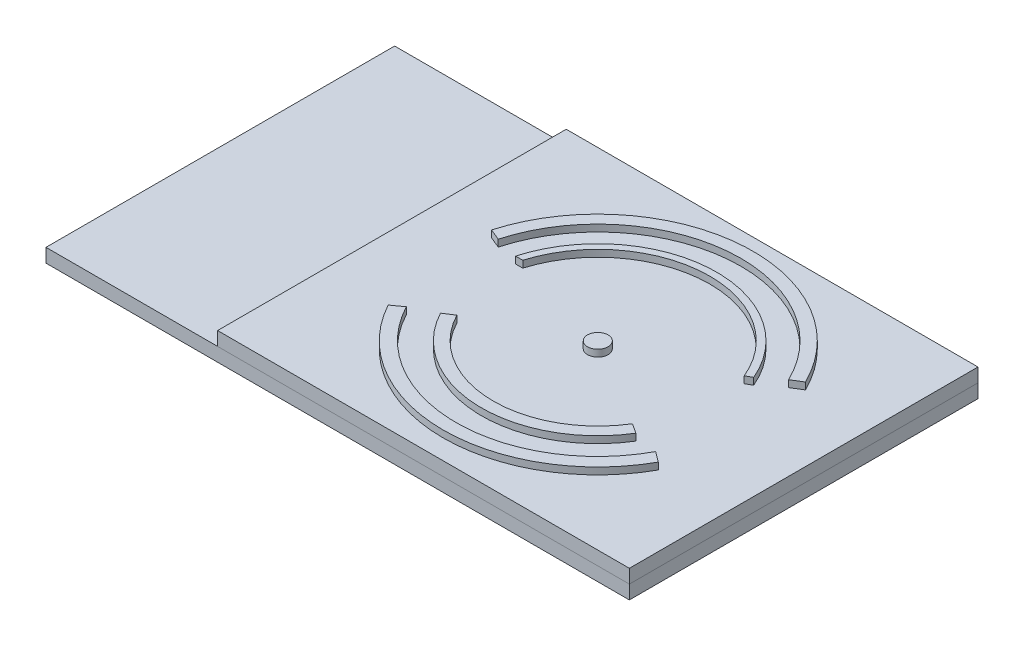
ISO-10303-21;
HEADER;
FILE_DESCRIPTION(('STEP AP214'),'2;1');
FILE_NAME('part.step','',(''),(''),'','','');
FILE_SCHEMA(('AUTOMOTIVE_DESIGN { 1 0 10303 214 1 1 1 1 }'));
ENDSEC;
DATA;
#1=APPLICATION_CONTEXT('core data for automotive mechanical design processes');
#2=APPLICATION_PROTOCOL_DEFINITION('international standard','automotive_design',2000,#1);
#3=PRODUCT_CONTEXT('',#1,'mechanical');
#4=PRODUCT('Part','Part','',(#3));
#5=PRODUCT_RELATED_PRODUCT_CATEGORY('part','',(#4));
#6=PRODUCT_DEFINITION_FORMATION('','',#4);
#7=PRODUCT_DEFINITION_CONTEXT('part definition',#1,'design');
#8=PRODUCT_DEFINITION('design','',#6,#7);
#9=PRODUCT_DEFINITION_SHAPE('','',#8);
#10=(LENGTH_UNIT() NAMED_UNIT(*) SI_UNIT(.MILLI.,.METRE.));
#11=(NAMED_UNIT(*) PLANE_ANGLE_UNIT() SI_UNIT($,.RADIAN.));
#12=(NAMED_UNIT(*) SI_UNIT($,.STERADIAN.) SOLID_ANGLE_UNIT());
#13=UNCERTAINTY_MEASURE_WITH_UNIT(LENGTH_MEASURE(1.E-05),#10,'distance_accuracy_value','');
#14=(GEOMETRIC_REPRESENTATION_CONTEXT(3) GLOBAL_UNCERTAINTY_ASSIGNED_CONTEXT((#13)) GLOBAL_UNIT_ASSIGNED_CONTEXT((#10,
#11,#12)) REPRESENTATION_CONTEXT('',''));
#15=CARTESIAN_POINT('',(0.,0.,0.));
#16=DIRECTION('',(0.,0.,1.));
#17=DIRECTION('',(1.,0.,0.));
#18=AXIS2_PLACEMENT_3D('',#15,#16,#17);
#19=CARTESIAN_POINT('',(6.25,2.5,0.));
#20=DIRECTION('',(0.,-1.,0.));
#21=DIRECTION('',(0.,0.,-1.));
#22=AXIS2_PLACEMENT_3D('',#19,#20,#21);
#23=CYLINDRICAL_SURFACE('',#22,10.3211820904023);
#24=CARTESIAN_POINT('',(6.25,2.,0.));
#25=DIRECTION('',(0.,-1.,0.));
#26=DIRECTION('',(0.,0.,-1.));
#27=AXIS2_PLACEMENT_3D('',#24,#25,#26);
#28=CIRCLE('',#27,10.3211820904023);
#29=CARTESIAN_POINT('',(15.3450943197244,2.,4.8791453205001));
#30=VERTEX_POINT('',#29);
#31=CARTESIAN_POINT('',(-2.87472662798124,2.,4.82350118771118));
#32=VERTEX_POINT('',#31);
#33=EDGE_CURVE('E12',#30,#32,#28,.T.);
#34=ORIENTED_EDGE('',*,*,#33,.T.);
#35=DIRECTION('',(0.,-1.,0.));
#36=VECTOR('',#35,1.);
#37=CARTESIAN_POINT('',(-2.87472662798124,2.5,4.82350118771118));
#38=LINE('',#37,#36);
#39=CARTESIAN_POINT('',(-2.87472662798124,2.5,4.82350118771118));
#40=VERTEX_POINT('',#39);
#41=EDGE_CURVE('E127',#40,#32,#38,.T.);
#42=ORIENTED_EDGE('',*,*,#41,.F.);
#43=CARTESIAN_POINT('',(6.25,2.5,0.));
#44=DIRECTION('',(0.,-1.,0.));
#45=DIRECTION('',(0.,0.,-1.));
#46=AXIS2_PLACEMENT_3D('',#43,#44,#45);
#47=CIRCLE('',#46,10.3211820904023);
#48=CARTESIAN_POINT('',(15.3450943197244,2.5,4.8791453205001));
#49=VERTEX_POINT('',#48);
#50=EDGE_CURVE('E60',#49,#40,#47,.T.);
#51=ORIENTED_EDGE('',*,*,#50,.F.);
#52=DIRECTION('',(0.,-1.,0.));
#53=VECTOR('',#52,1.);
#54=CARTESIAN_POINT('',(15.3450943197244,2.5,4.8791453205001));
#55=LINE('',#54,#53);
#56=EDGE_CURVE('E115',#49,#30,#55,.T.);
#57=ORIENTED_EDGE('',*,*,#56,.T.);
#58=EDGE_LOOP('',(#34,#42,#51,#57));
#59=FACE_BOUND('',#58,.T.);
#60=ADVANCED_FACE('F56',(#59),#23,.F.);
#61=CARTESIAN_POINT('',(-2.87472662798124,2.5,4.82350118771118));
#62=DIRECTION('',(0.585107471829665,0.,0.810955761067826));
#63=DIRECTION('',(0.810955761067826,0.,-0.585107471829665));
#64=AXIS2_PLACEMENT_3D('',#61,#62,#63);
#65=PLANE('',#64);
#66=DIRECTION('',(-0.810955761067826,0.,0.585107471829665));
#67=VECTOR('',#66,1.);
#68=CARTESIAN_POINT('',(-2.87472662798124,2.,4.82350118771118));
#69=LINE('',#68,#67);
#70=CARTESIAN_POINT('',(-3.64229657779975,2.,5.37730564209888));
#71=VERTEX_POINT('',#70);
#72=EDGE_CURVE('E66',#32,#71,#69,.T.);
#73=ORIENTED_EDGE('',*,*,#72,.T.);
#74=DIRECTION('',(0.,-1.,0.));
#75=VECTOR('',#74,1.);
#76=CARTESIAN_POINT('',(-3.64229657779975,2.5,5.37730564209888));
#77=LINE('',#76,#75);
#78=CARTESIAN_POINT('',(-3.64229657779975,2.5,5.37730564209888));
#79=VERTEX_POINT('',#78);
#80=EDGE_CURVE('E111',#79,#71,#77,.T.);
#81=ORIENTED_EDGE('',*,*,#80,.F.);
#82=DIRECTION('',(-0.810955761067826,0.,0.585107471829665));
#83=VECTOR('',#82,1.);
#84=CARTESIAN_POINT('',(-2.87472662798124,2.5,4.82350118771118));
#85=LINE('',#84,#83);
#86=EDGE_CURVE('E90',#40,#79,#85,.T.);
#87=ORIENTED_EDGE('',*,*,#86,.F.);
#88=ORIENTED_EDGE('',*,*,#41,.T.);
#89=EDGE_LOOP('',(#73,#81,#87,#88));
#90=FACE_BOUND('',#89,.T.);
#91=ADVANCED_FACE('F130',(#90),#65,.F.);
#92=CARTESIAN_POINT('',(6.25,2.5,0.));
#93=DIRECTION('',(0.,-1.,0.));
#94=DIRECTION('',(0.,0.,-1.));
#95=AXIS2_PLACEMENT_3D('',#92,#93,#94);
#96=CYLINDRICAL_SURFACE('',#95,11.2593493396243);
#97=CARTESIAN_POINT('',(6.25,2.,0.));
#98=DIRECTION('',(0.,1.,0.));
#99=DIRECTION('',(0.,0.,-1.));
#100=AXIS2_PLACEMENT_3D('',#97,#98,#99);
#101=CIRCLE('',#100,11.2593493396243);
#102=CARTESIAN_POINT('',(16.1049354626712,2.,5.44547468805814));
#103=VERTEX_POINT('',#102);
#104=EDGE_CURVE('E106',#71,#103,#101,.T.);
#105=ORIENTED_EDGE('',*,*,#104,.T.);
#106=DIRECTION('',(0.,-1.,0.));
#107=VECTOR('',#106,1.);
#108=CARTESIAN_POINT('',(16.1049354626712,2.5,5.44547468805814));
#109=LINE('',#108,#107);
#110=CARTESIAN_POINT('',(16.1049354626712,2.5,5.44547468805814));
#111=VERTEX_POINT('',#110);
#112=EDGE_CURVE('E109',#111,#103,#109,.T.);
#113=ORIENTED_EDGE('',*,*,#112,.F.);
#114=CARTESIAN_POINT('',(6.25,2.5,0.));
#115=DIRECTION('',(0.,1.,0.));
#116=DIRECTION('',(0.,0.,-1.));
#117=AXIS2_PLACEMENT_3D('',#114,#115,#116);
#118=CIRCLE('',#117,11.2593493396243);
#119=EDGE_CURVE('E123',#79,#111,#118,.T.);
#120=ORIENTED_EDGE('',*,*,#119,.F.);
#121=ORIENTED_EDGE('',*,*,#80,.T.);
#122=EDGE_LOOP('',(#105,#113,#120,#121));
#123=FACE_BOUND('',#122,.T.);
#124=ADVANCED_FACE('F107',(#123),#96,.T.);
#125=CARTESIAN_POINT('',(15.3450943197244,2.5,4.8791453205001));
#126=DIRECTION('',(-0.597598850553127,0.,0.801795244322128));
#127=DIRECTION('',(0.801795244322129,0.,0.597598850553127));
#128=AXIS2_PLACEMENT_3D('',#125,#126,#127);
#129=PLANE('',#128);
#130=DIRECTION('',(-0.801795244322128,0.,-0.597598850553127));
#131=VECTOR('',#130,1.);
#132=CARTESIAN_POINT('',(15.3450943197244,2.,4.8791453205001));
#133=LINE('',#132,#131);
#134=EDGE_CURVE('E100',#103,#30,#133,.T.);
#135=ORIENTED_EDGE('',*,*,#134,.T.);
#136=ORIENTED_EDGE('',*,*,#56,.F.);
#137=DIRECTION('',(-0.801795244322128,0.,-0.597598850553127));
#138=VECTOR('',#137,1.);
#139=CARTESIAN_POINT('',(15.3450943197244,2.5,4.8791453205001));
#140=LINE('',#139,#138);
#141=EDGE_CURVE('E114',#111,#49,#140,.T.);
#142=ORIENTED_EDGE('',*,*,#141,.F.);
#143=ORIENTED_EDGE('',*,*,#112,.T.);
#144=EDGE_LOOP('',(#135,#136,#142,#143));
#145=FACE_BOUND('',#144,.T.);
#146=ADVANCED_FACE('F113',(#145),#129,.F.);
#147=CARTESIAN_POINT('',(6.25,2.5,0.));
#148=DIRECTION('',(0.,-1.,0.));
#149=DIRECTION('',(0.,0.,-1.));
#150=AXIS2_PLACEMENT_3D('',#147,#148,#149);
#151=PLANE('',#150);
#152=ORIENTED_EDGE('',*,*,#50,.T.);
#153=ORIENTED_EDGE('',*,*,#86,.T.);
#154=ORIENTED_EDGE('',*,*,#119,.T.);
#155=ORIENTED_EDGE('',*,*,#141,.T.);
#156=EDGE_LOOP('',(#152,#153,#154,#155));
#157=FACE_BOUND('',#156,.T.);
#158=ADVANCED_FACE('F58',(#157),#151,.F.);
#159=CARTESIAN_POINT('',(6.25,2.,0.));
#160=DIRECTION('',(0.,-1.,0.));
#161=DIRECTION('',(0.,0.,-1.));
#162=AXIS2_PLACEMENT_3D('',#159,#160,#161);
#163=PLANE('',#162);
#164=ORIENTED_EDGE('',*,*,#33,.F.);
#165=ORIENTED_EDGE('',*,*,#134,.F.);
#166=ORIENTED_EDGE('',*,*,#104,.F.);
#167=ORIENTED_EDGE('',*,*,#72,.F.);
#168=EDGE_LOOP('',(#164,#165,#166,#167));
#169=FACE_BOUND('',#168,.T.);
#170=ADVANCED_FACE('F117',(#169),#163,.T.);
#171=CLOSED_SHELL('',(#60,#91,#124,#146,#158,#170));
#172=MANIFOLD_SOLID_BREP('B2',#171);
#173=CARTESIAN_POINT('',(6.25,2.5,0.));
#174=DIRECTION('',(0.,-1.,0.));
#175=DIRECTION('',(0.,0.,-1.));
#176=AXIS2_PLACEMENT_3D('',#173,#174,#175);
#177=CYLINDRICAL_SURFACE('',#176,8.47032210993018);
#178=CARTESIAN_POINT('',(6.25,2.,0.));
#179=DIRECTION('',(0.,1.,0.));
#180=DIRECTION('',(0.,0.,-1.));
#181=AXIS2_PLACEMENT_3D('',#178,#179,#180);
#182=CIRCLE('',#181,8.47032210993018);
#183=CARTESIAN_POINT('',(-1.22662380104751,2.,3.98076037756379));
#184=VERTEX_POINT('',#183);
#185=CARTESIAN_POINT('',(13.4612134288797,2.,4.44350734545545));
#186=VERTEX_POINT('',#185);
#187=EDGE_CURVE('E54',#184,#186,#182,.T.);
#188=ORIENTED_EDGE('',*,*,#187,.T.);
#189=DIRECTION('',(0.,-1.,0.));
#190=VECTOR('',#189,1.);
#191=CARTESIAN_POINT('',(13.4612134288797,2.5,4.44350734545545));
#192=LINE('',#191,#190);
#193=CARTESIAN_POINT('',(13.4612134288797,2.5,4.44350734545545));
#194=VERTEX_POINT('',#193);
#195=EDGE_CURVE('E273',#194,#186,#192,.T.);
#196=ORIENTED_EDGE('',*,*,#195,.F.);
#197=CARTESIAN_POINT('',(6.25,2.5,0.));
#198=DIRECTION('',(0.,1.,0.));
#199=DIRECTION('',(0.,0.,-1.));
#200=AXIS2_PLACEMENT_3D('',#197,#198,#199);
#201=CIRCLE('',#200,8.47032210993018);
#202=CARTESIAN_POINT('',(-1.22662380104751,2.5,3.98076037756379));
#203=VERTEX_POINT('',#202);
#204=EDGE_CURVE('E206',#203,#194,#201,.T.);
#205=ORIENTED_EDGE('',*,*,#204,.F.);
#206=DIRECTION('',(0.,-1.,0.));
#207=VECTOR('',#206,1.);
#208=CARTESIAN_POINT('',(-1.22662380104751,2.5,3.98076037756379));
#209=LINE('',#208,#207);
#210=EDGE_CURVE('E261',#203,#184,#209,.T.);
#211=ORIENTED_EDGE('',*,*,#210,.T.);
#212=EDGE_LOOP('',(#188,#196,#205,#211));
#213=FACE_BOUND('',#212,.T.);
#214=ADVANCED_FACE('F202',(#213),#177,.T.);
#215=CARTESIAN_POINT('',(12.7464220030099,2.5,3.96430557290633));
#216=DIRECTION('',(-0.556849663647804,0.,0.830613298771051));
#217=DIRECTION('',(0.830613298771051,0.,0.556849663647804));
#218=AXIS2_PLACEMENT_3D('',#215,#216,#217);
#219=PLANE('',#218);
#220=DIRECTION('',(-0.830613298771051,0.,-0.556849663647804));
#221=VECTOR('',#220,1.);
#222=CARTESIAN_POINT('',(12.7464220030099,2.,3.96430557290633));
#223=LINE('',#222,#221);
#224=CARTESIAN_POINT('',(12.7464220030099,2.,3.96430557290633));
#225=VERTEX_POINT('',#224);
#226=EDGE_CURVE('E212',#186,#225,#223,.T.);
#227=ORIENTED_EDGE('',*,*,#226,.T.);
#228=DIRECTION('',(0.,-1.,0.));
#229=VECTOR('',#228,1.);
#230=CARTESIAN_POINT('',(12.7464220030099,2.5,3.96430557290633));
#231=LINE('',#230,#229);
#232=CARTESIAN_POINT('',(12.7464220030099,2.5,3.96430557290633));
#233=VERTEX_POINT('',#232);
#234=EDGE_CURVE('E257',#233,#225,#231,.T.);
#235=ORIENTED_EDGE('',*,*,#234,.F.);
#236=DIRECTION('',(-0.830613298771051,0.,-0.556849663647804));
#237=VECTOR('',#236,1.);
#238=CARTESIAN_POINT('',(12.7464220030099,2.5,3.96430557290633));
#239=LINE('',#238,#237);
#240=EDGE_CURVE('E236',#194,#233,#239,.T.);
#241=ORIENTED_EDGE('',*,*,#240,.F.);
#242=ORIENTED_EDGE('',*,*,#195,.T.);
#243=EDGE_LOOP('',(#227,#235,#241,#242));
#244=FACE_BOUND('',#243,.T.);
#245=ADVANCED_FACE('F276',(#244),#219,.F.);
#246=CARTESIAN_POINT('',(6.25,2.5,0.));
#247=DIRECTION('',(0.,-1.,0.));
#248=DIRECTION('',(0.,0.,-1.));
#249=AXIS2_PLACEMENT_3D('',#246,#247,#248);
#250=CYLINDRICAL_SURFACE('',#249,7.61046762798235);
#251=CARTESIAN_POINT('',(6.25,2.,0.));
#252=DIRECTION('',(0.,-1.,0.));
#253=DIRECTION('',(0.,0.,-1.));
#254=AXIS2_PLACEMENT_3D('',#251,#252,#253);
#255=CIRCLE('',#254,7.61046762798235);
#256=CARTESIAN_POINT('',(-0.502014789210819,2.,3.51134074148972));
#257=VERTEX_POINT('',#256);
#258=EDGE_CURVE('E252',#225,#257,#255,.T.);
#259=ORIENTED_EDGE('',*,*,#258,.T.);
#260=DIRECTION('',(0.,-1.,0.));
#261=VECTOR('',#260,1.);
#262=CARTESIAN_POINT('',(-0.502014789210819,2.5,3.51134074148972));
#263=LINE('',#262,#261);
#264=CARTESIAN_POINT('',(-0.502014789210819,2.5,3.51134074148972));
#265=VERTEX_POINT('',#264);
#266=EDGE_CURVE('E255',#265,#257,#263,.T.);
#267=ORIENTED_EDGE('',*,*,#266,.F.);
#268=CARTESIAN_POINT('',(6.25,2.5,0.));
#269=DIRECTION('',(0.,-1.,0.));
#270=DIRECTION('',(0.,0.,-1.));
#271=AXIS2_PLACEMENT_3D('',#268,#269,#270);
#272=CIRCLE('',#271,7.61046762798235);
#273=EDGE_CURVE('E269',#233,#265,#272,.T.);
#274=ORIENTED_EDGE('',*,*,#273,.F.);
#275=ORIENTED_EDGE('',*,*,#234,.T.);
#276=EDGE_LOOP('',(#259,#267,#274,#275));
#277=FACE_BOUND('',#276,.T.);
#278=ADVANCED_FACE('F253',(#277),#250,.F.);
#279=CARTESIAN_POINT('',(-1.22662380104751,2.5,3.98076037756379));
#280=DIRECTION('',(0.543704298869747,0.,0.839276852647896));
#281=DIRECTION('',(0.839276852647896,0.,-0.543704298869747));
#282=AXIS2_PLACEMENT_3D('',#279,#280,#281);
#283=PLANE('',#282);
#284=DIRECTION('',(-0.839276852647896,0.,0.543704298869747));
#285=VECTOR('',#284,1.);
#286=CARTESIAN_POINT('',(-1.22662380104751,2.,3.98076037756379));
#287=LINE('',#286,#285);
#288=EDGE_CURVE('E246',#257,#184,#287,.T.);
#289=ORIENTED_EDGE('',*,*,#288,.T.);
#290=ORIENTED_EDGE('',*,*,#210,.F.);
#291=DIRECTION('',(-0.839276852647896,0.,0.543704298869747));
#292=VECTOR('',#291,1.);
#293=CARTESIAN_POINT('',(-1.22662380104751,2.5,3.98076037756379));
#294=LINE('',#293,#292);
#295=EDGE_CURVE('E260',#265,#203,#294,.T.);
#296=ORIENTED_EDGE('',*,*,#295,.F.);
#297=ORIENTED_EDGE('',*,*,#266,.T.);
#298=EDGE_LOOP('',(#289,#290,#296,#297));
#299=FACE_BOUND('',#298,.T.);
#300=ADVANCED_FACE('F259',(#299),#283,.F.);
#301=CARTESIAN_POINT('',(6.25,2.5,0.));
#302=DIRECTION('',(0.,-1.,0.));
#303=DIRECTION('',(0.,0.,-1.));
#304=AXIS2_PLACEMENT_3D('',#301,#302,#303);
#305=PLANE('',#304);
#306=ORIENTED_EDGE('',*,*,#204,.T.);
#307=ORIENTED_EDGE('',*,*,#240,.T.);
#308=ORIENTED_EDGE('',*,*,#273,.T.);
#309=ORIENTED_EDGE('',*,*,#295,.T.);
#310=EDGE_LOOP('',(#306,#307,#308,#309));
#311=FACE_BOUND('',#310,.T.);
#312=ADVANCED_FACE('F204',(#311),#305,.F.);
#313=CARTESIAN_POINT('',(6.25,2.,0.));
#314=DIRECTION('',(0.,-1.,0.));
#315=DIRECTION('',(0.,0.,-1.));
#316=AXIS2_PLACEMENT_3D('',#313,#314,#315);
#317=PLANE('',#316);
#318=ORIENTED_EDGE('',*,*,#187,.F.);
#319=ORIENTED_EDGE('',*,*,#288,.F.);
#320=ORIENTED_EDGE('',*,*,#258,.F.);
#321=ORIENTED_EDGE('',*,*,#226,.F.);
#322=EDGE_LOOP('',(#318,#319,#320,#321));
#323=FACE_BOUND('',#322,.T.);
#324=ADVANCED_FACE('F263',(#323),#317,.T.);
#325=CLOSED_SHELL('',(#214,#245,#278,#300,#312,#324));
#326=MANIFOLD_SOLID_BREP('B6',#325);
#327=CARTESIAN_POINT('',(6.25,2.5,0.));
#328=DIRECTION('',(0.,-1.,0.));
#329=DIRECTION('',(0.,0.,-1.));
#330=AXIS2_PLACEMENT_3D('',#327,#328,#329);
#331=CYLINDRICAL_SURFACE('',#330,10.4199817049008);
#332=CARTESIAN_POINT('',(6.25,2.,0.));
#333=DIRECTION('',(0.,-1.,0.));
#334=DIRECTION('',(0.,0.,-1.));
#335=AXIS2_PLACEMENT_3D('',#332,#333,#334);
#336=CIRCLE('',#335,10.4199817049008);
#337=CARTESIAN_POINT('',(-3.79005038288847,2.,-2.78808304028578));
#338=VERTEX_POINT('',#337);
#339=CARTESIAN_POINT('',(15.6500409022557,2.,-4.49613720502264));
#340=VERTEX_POINT('',#339);
#341=EDGE_CURVE('E200',#338,#340,#336,.T.);
#342=ORIENTED_EDGE('',*,*,#341,.T.);
#343=DIRECTION('',(0.,-1.,0.));
#344=VECTOR('',#343,1.);
#345=CARTESIAN_POINT('',(15.6500409022557,2.5,-4.49613720502264));
#346=LINE('',#345,#344);
#347=CARTESIAN_POINT('',(15.6500409022557,2.5,-4.49613720502264));
#348=VERTEX_POINT('',#347);
#349=EDGE_CURVE('E419',#348,#340,#346,.T.);
#350=ORIENTED_EDGE('',*,*,#349,.F.);
#351=CARTESIAN_POINT('',(6.25,2.5,0.));
#352=DIRECTION('',(0.,-1.,0.));
#353=DIRECTION('',(0.,0.,-1.));
#354=AXIS2_PLACEMENT_3D('',#351,#352,#353);
#355=CIRCLE('',#354,10.4199817049008);
#356=CARTESIAN_POINT('',(-3.79005038288847,2.5,-2.78808304028578));
#357=VERTEX_POINT('',#356);
#358=EDGE_CURVE('E352',#357,#348,#355,.T.);
#359=ORIENTED_EDGE('',*,*,#358,.F.);
#360=DIRECTION('',(0.,-1.,0.));
#361=VECTOR('',#360,1.);
#362=CARTESIAN_POINT('',(-3.79005038288847,2.5,-2.78808304028578));
#363=LINE('',#362,#361);
#364=EDGE_CURVE('E407',#357,#338,#363,.T.);
#365=ORIENTED_EDGE('',*,*,#364,.T.);
#366=EDGE_LOOP('',(#342,#350,#359,#365));
#367=FACE_BOUND('',#366,.T.);
#368=ADVANCED_FACE('F348',(#367),#331,.F.);
#369=CARTESIAN_POINT('',(15.6500409022557,2.5,-4.49613720502264));
#370=DIRECTION('',(-0.526150268276154,0.,-0.850391612842537));
#371=DIRECTION('',(-0.850391612842537,0.,0.526150268276154));
#372=AXIS2_PLACEMENT_3D('',#369,#370,#371);
#373=PLANE('',#372);
#374=DIRECTION('',(0.850391612842537,0.,-0.526150268276154));
#375=VECTOR('',#374,1.);
#376=CARTESIAN_POINT('',(15.6500409022557,2.,-4.49613720502264));
#377=LINE('',#376,#375);
#378=CARTESIAN_POINT('',(16.4098820452025,2.,-4.96626251572789));
#379=VERTEX_POINT('',#378);
#380=EDGE_CURVE('E358',#340,#379,#377,.T.);
#381=ORIENTED_EDGE('',*,*,#380,.T.);
#382=DIRECTION('',(0.,-1.,0.));
#383=VECTOR('',#382,1.);
#384=CARTESIAN_POINT('',(16.4098820452025,2.5,-4.96626251572789));
#385=LINE('',#384,#383);
#386=CARTESIAN_POINT('',(16.4098820452025,2.5,-4.96626251572789));
#387=VERTEX_POINT('',#386);
#388=EDGE_CURVE('E403',#387,#379,#385,.T.);
#389=ORIENTED_EDGE('',*,*,#388,.F.);
#390=DIRECTION('',(0.850391612842537,0.,-0.526150268276154));
#391=VECTOR('',#390,1.);
#392=CARTESIAN_POINT('',(15.6500409022557,2.5,-4.49613720502264));
#393=LINE('',#392,#391);
#394=EDGE_CURVE('E382',#348,#387,#393,.T.);
#395=ORIENTED_EDGE('',*,*,#394,.F.);
#396=ORIENTED_EDGE('',*,*,#349,.T.);
#397=EDGE_LOOP('',(#381,#389,#395,#396));
#398=FACE_BOUND('',#397,.T.);
#399=ADVANCED_FACE('F422',(#398),#373,.F.);
#400=CARTESIAN_POINT('',(6.25,2.5,0.));
#401=DIRECTION('',(0.,-1.,0.));
#402=DIRECTION('',(0.,0.,-1.));
#403=AXIS2_PLACEMENT_3D('',#400,#401,#402);
#404=CYLINDRICAL_SURFACE('',#403,11.3087119756209);
#405=CARTESIAN_POINT('',(6.25,2.,0.));
#406=DIRECTION('',(0.,1.,0.));
#407=DIRECTION('',(0.,0.,-1.));
#408=AXIS2_PLACEMENT_3D('',#405,#406,#407);
#409=CIRCLE('',#408,11.3087119756209);
#410=CARTESIAN_POINT('',(-4.61776253547332,2.,-3.12709194302222));
#411=VERTEX_POINT('',#410);
#412=EDGE_CURVE('E398',#379,#411,#409,.T.);
#413=ORIENTED_EDGE('',*,*,#412,.T.);
#414=DIRECTION('',(0.,-1.,0.));
#415=VECTOR('',#414,1.);
#416=CARTESIAN_POINT('',(-4.61776253547332,2.5,-3.12709194302222));
#417=LINE('',#416,#415);
#418=CARTESIAN_POINT('',(-4.61776253547332,2.5,-3.12709194302222));
#419=VERTEX_POINT('',#418);
#420=EDGE_CURVE('E401',#419,#411,#417,.T.);
#421=ORIENTED_EDGE('',*,*,#420,.F.);
#422=CARTESIAN_POINT('',(6.25,2.5,0.));
#423=DIRECTION('',(0.,1.,0.));
#424=DIRECTION('',(0.,0.,-1.));
#425=AXIS2_PLACEMENT_3D('',#422,#423,#424);
#426=CIRCLE('',#425,11.3087119756209);
#427=EDGE_CURVE('E415',#387,#419,#426,.T.);
#428=ORIENTED_EDGE('',*,*,#427,.F.);
#429=ORIENTED_EDGE('',*,*,#388,.T.);
#430=EDGE_LOOP('',(#413,#421,#428,#429));
#431=FACE_BOUND('',#430,.T.);
#432=ADVANCED_FACE('F399',(#431),#404,.T.);
#433=CARTESIAN_POINT('',(-4.61776253547332,2.5,-3.12709194302222));
#434=DIRECTION('',(0.379015316661629,0.,-0.925390398553975));
#435=DIRECTION('',(-0.925390398553975,0.,-0.379015316661629));
#436=AXIS2_PLACEMENT_3D('',#433,#434,#435);
#437=PLANE('',#436);
#438=DIRECTION('',(0.925390398553975,0.,0.379015316661629));
#439=VECTOR('',#438,1.);
#440=CARTESIAN_POINT('',(-4.61776253547332,2.,-3.12709194302222));
#441=LINE('',#440,#439);
#442=EDGE_CURVE('E392',#411,#338,#441,.T.);
#443=ORIENTED_EDGE('',*,*,#442,.T.);
#444=ORIENTED_EDGE('',*,*,#364,.F.);
#445=DIRECTION('',(0.925390398553975,0.,0.379015316661629));
#446=VECTOR('',#445,1.);
#447=CARTESIAN_POINT('',(-4.61776253547332,2.5,-3.12709194302222));
#448=LINE('',#447,#446);
#449=EDGE_CURVE('E406',#419,#357,#448,.T.);
#450=ORIENTED_EDGE('',*,*,#449,.F.);
#451=ORIENTED_EDGE('',*,*,#420,.T.);
#452=EDGE_LOOP('',(#443,#444,#450,#451));
#453=FACE_BOUND('',#452,.T.);
#454=ADVANCED_FACE('F405',(#453),#437,.F.);
#455=CARTESIAN_POINT('',(6.25,2.5,0.));
#456=DIRECTION('',(0.,-1.,0.));
#457=DIRECTION('',(0.,0.,-1.));
#458=AXIS2_PLACEMENT_3D('',#455,#456,#457);
#459=PLANE('',#458);
#460=ORIENTED_EDGE('',*,*,#358,.T.);
#461=ORIENTED_EDGE('',*,*,#394,.T.);
#462=ORIENTED_EDGE('',*,*,#427,.T.);
#463=ORIENTED_EDGE('',*,*,#449,.T.);
#464=EDGE_LOOP('',(#460,#461,#462,#463));
#465=FACE_BOUND('',#464,.T.);
#466=ADVANCED_FACE('F350',(#465),#459,.F.);
#467=CARTESIAN_POINT('',(6.25,2.,0.));
#468=DIRECTION('',(0.,-1.,0.));
#469=DIRECTION('',(0.,0.,-1.));
#470=AXIS2_PLACEMENT_3D('',#467,#468,#469);
#471=PLANE('',#470);
#472=ORIENTED_EDGE('',*,*,#341,.F.);
#473=ORIENTED_EDGE('',*,*,#442,.F.);
#474=ORIENTED_EDGE('',*,*,#412,.F.);
#475=ORIENTED_EDGE('',*,*,#380,.F.);
#476=EDGE_LOOP('',(#472,#473,#474,#475));
#477=FACE_BOUND('',#476,.T.);
#478=ADVANCED_FACE('F409',(#477),#471,.T.);
#479=CLOSED_SHELL('',(#368,#399,#432,#454,#466,#478));
#480=MANIFOLD_SOLID_BREP('B48',#479);
#481=CARTESIAN_POINT('',(6.25,2.5,0.));
#482=DIRECTION('',(0.,-1.,0.));
#483=DIRECTION('',(0.,0.,-1.));
#484=AXIS2_PLACEMENT_3D('',#481,#482,#483);
#485=CYLINDRICAL_SURFACE('',#484,8.1645429286083);
#486=CARTESIAN_POINT('',(6.25,2.,0.));
#487=DIRECTION('',(0.,-1.,0.));
#488=DIRECTION('',(0.,0.,-1.));
#489=AXIS2_PLACEMENT_3D('',#486,#487,#488);
#490=CIRCLE('',#489,8.1645429286083);
#491=CARTESIAN_POINT('',(-1.56829671016075,2.,-2.35244506524113));
#492=VERTEX_POINT('',#491);
#493=CARTESIAN_POINT('',(13.7919531431171,2.,-3.12709194302222));
#494=VERTEX_POINT('',#493);
#495=EDGE_CURVE('E346',#492,#494,#490,.T.);
#496=ORIENTED_EDGE('',*,*,#495,.T.);
#497=DIRECTION('',(0.,-1.,0.));
#498=VECTOR('',#497,1.);
#499=CARTESIAN_POINT('',(13.7919531431171,2.5,-3.12709194302222));
#500=LINE('',#499,#498);
#501=CARTESIAN_POINT('',(13.7919531431171,2.5,-3.12709194302222));
#502=VERTEX_POINT('',#501);
#503=EDGE_CURVE('E563',#502,#494,#500,.T.);
#504=ORIENTED_EDGE('',*,*,#503,.F.);
#505=CARTESIAN_POINT('',(6.25,2.5,0.));
#506=DIRECTION('',(0.,-1.,0.));
#507=DIRECTION('',(0.,0.,-1.));
#508=AXIS2_PLACEMENT_3D('',#505,#506,#507);
#509=CIRCLE('',#508,8.1645429286083);
#510=CARTESIAN_POINT('',(-1.56829671016075,2.5,-2.35244506524113));
#511=VERTEX_POINT('',#510);
#512=EDGE_CURVE('E496',#511,#502,#509,.T.);
#513=ORIENTED_EDGE('',*,*,#512,.F.);
#514=DIRECTION('',(0.,-1.,0.));
#515=VECTOR('',#514,1.);
#516=CARTESIAN_POINT('',(-1.56829671016075,2.5,-2.35244506524113));
#517=LINE('',#516,#515);
#518=EDGE_CURVE('E551',#511,#492,#517,.T.);
#519=ORIENTED_EDGE('',*,*,#518,.T.);
#520=EDGE_LOOP('',(#496,#504,#513,#519));
#521=FACE_BOUND('',#520,.T.);
#522=ADVANCED_FACE('F492',(#521),#485,.F.);
#523=CARTESIAN_POINT('',(13.7919531431171,2.5,-3.12709194302222));
#524=DIRECTION('',(-0.486142011633246,0.,-0.873879822701715));
#525=DIRECTION('',(-0.873879822701715,0.,0.486142011633246));
#526=AXIS2_PLACEMENT_3D('',#523,#524,#525);
#527=PLANE('',#526);
#528=DIRECTION('',(0.873879822701715,0.,-0.486142011633246));
#529=VECTOR('',#528,1.);
#530=CARTESIAN_POINT('',(13.7919531431171,2.,-3.12709194302222));
#531=LINE('',#530,#529);
#532=CARTESIAN_POINT('',(14.2332852923842,2.,-3.3726063641927));
#533=VERTEX_POINT('',#532);
#534=EDGE_CURVE('E502',#494,#533,#531,.T.);
#535=ORIENTED_EDGE('',*,*,#534,.T.);
#536=DIRECTION('',(0.,-1.,0.));
#537=VECTOR('',#536,1.);
#538=CARTESIAN_POINT('',(14.2332852923842,2.5,-3.3726063641927));
#539=LINE('',#538,#537);
#540=CARTESIAN_POINT('',(14.2332852923842,2.5,-3.3726063641927));
#541=VERTEX_POINT('',#540);
#542=EDGE_CURVE('E547',#541,#533,#539,.T.);
#543=ORIENTED_EDGE('',*,*,#542,.F.);
#544=DIRECTION('',(0.873879822701715,0.,-0.486142011633246));
#545=VECTOR('',#544,1.);
#546=CARTESIAN_POINT('',(13.7919531431171,2.5,-3.12709194302222));
#547=LINE('',#546,#545);
#548=EDGE_CURVE('E526',#502,#541,#547,.T.);
#549=ORIENTED_EDGE('',*,*,#548,.F.);
#550=ORIENTED_EDGE('',*,*,#503,.T.);
#551=EDGE_LOOP('',(#535,#543,#549,#550));
#552=FACE_BOUND('',#551,.T.);
#553=ADVANCED_FACE('F566',(#552),#527,.F.);
#554=CARTESIAN_POINT('',(6.25,2.5,0.));
#555=DIRECTION('',(0.,-1.,0.));
#556=DIRECTION('',(0.,0.,-1.));
#557=AXIS2_PLACEMENT_3D('',#554,#555,#556);
#558=CYLINDRICAL_SURFACE('',#557,8.66644781599656);
#559=CARTESIAN_POINT('',(6.25,2.,0.));
#560=DIRECTION('',(0.,1.,0.));
#561=DIRECTION('',(0.,0.,-1.));
#562=AXIS2_PLACEMENT_3D('',#559,#560,#561);
#563=CIRCLE('',#562,8.66644781599656);
#564=CARTESIAN_POINT('',(-2.09106228021433,2.,-2.35244506524113));
#565=VERTEX_POINT('',#564);
#566=EDGE_CURVE('E542',#533,#565,#563,.T.);
#567=ORIENTED_EDGE('',*,*,#566,.T.);
#568=DIRECTION('',(0.,-1.,0.));
#569=VECTOR('',#568,1.);
#570=CARTESIAN_POINT('',(-2.09106228021433,2.5,-2.35244506524113));
#571=LINE('',#570,#569);
#572=CARTESIAN_POINT('',(-2.09106228021433,2.5,-2.35244506524113));
#573=VERTEX_POINT('',#572);
#574=EDGE_CURVE('E545',#573,#565,#571,.T.);
#575=ORIENTED_EDGE('',*,*,#574,.F.);
#576=CARTESIAN_POINT('',(6.25,2.5,0.));
#577=DIRECTION('',(0.,1.,0.));
#578=DIRECTION('',(0.,0.,-1.));
#579=AXIS2_PLACEMENT_3D('',#576,#577,#578);
#580=CIRCLE('',#579,8.66644781599656);
#581=EDGE_CURVE('E559',#541,#573,#580,.T.);
#582=ORIENTED_EDGE('',*,*,#581,.F.);
#583=ORIENTED_EDGE('',*,*,#542,.T.);
#584=EDGE_LOOP('',(#567,#575,#582,#583));
#585=FACE_BOUND('',#584,.T.);
#586=ADVANCED_FACE('F543',(#585),#558,.T.);
#587=CARTESIAN_POINT('',(-2.09106228021433,2.5,-2.35244506524113));
#588=DIRECTION('',(0.,0.,-1.));
#589=DIRECTION('',(-1.,0.,0.));
#590=AXIS2_PLACEMENT_3D('',#587,#588,#589);
#591=PLANE('',#590);
#592=DIRECTION('',(1.,0.,0.));
#593=VECTOR('',#592,1.);
#594=CARTESIAN_POINT('',(-2.09106228021433,2.,-2.35244506524113));
#595=LINE('',#594,#593);
#596=EDGE_CURVE('E536',#565,#492,#595,.T.);
#597=ORIENTED_EDGE('',*,*,#596,.T.);
#598=ORIENTED_EDGE('',*,*,#518,.F.);
#599=DIRECTION('',(1.,0.,0.));
#600=VECTOR('',#599,1.);
#601=CARTESIAN_POINT('',(-2.09106228021433,2.5,-2.35244506524113));
#602=LINE('',#601,#600);
#603=EDGE_CURVE('E550',#573,#511,#602,.T.);
#604=ORIENTED_EDGE('',*,*,#603,.F.);
#605=ORIENTED_EDGE('',*,*,#574,.T.);
#606=EDGE_LOOP('',(#597,#598,#604,#605));
#607=FACE_BOUND('',#606,.T.);
#608=ADVANCED_FACE('F549',(#607),#591,.F.);
#609=CARTESIAN_POINT('',(6.25,2.5,0.));
#610=DIRECTION('',(0.,-1.,0.));
#611=DIRECTION('',(0.,0.,-1.));
#612=AXIS2_PLACEMENT_3D('',#609,#610,#611);
#613=PLANE('',#612);
#614=ORIENTED_EDGE('',*,*,#512,.T.);
#615=ORIENTED_EDGE('',*,*,#548,.T.);
#616=ORIENTED_EDGE('',*,*,#581,.T.);
#617=ORIENTED_EDGE('',*,*,#603,.T.);
#618=EDGE_LOOP('',(#614,#615,#616,#617));
#619=FACE_BOUND('',#618,.T.);
#620=ADVANCED_FACE('F494',(#619),#613,.F.);
#621=CARTESIAN_POINT('',(6.25,2.,0.));
#622=DIRECTION('',(0.,-1.,0.));
#623=DIRECTION('',(0.,0.,-1.));
#624=AXIS2_PLACEMENT_3D('',#621,#622,#623);
#625=PLANE('',#624);
#626=ORIENTED_EDGE('',*,*,#495,.F.);
#627=ORIENTED_EDGE('',*,*,#596,.F.);
#628=ORIENTED_EDGE('',*,*,#566,.F.);
#629=ORIENTED_EDGE('',*,*,#534,.F.);
#630=EDGE_LOOP('',(#626,#627,#628,#629));
#631=FACE_BOUND('',#630,.T.);
#632=ADVANCED_FACE('F553',(#631),#625,.T.);
#633=CLOSED_SHELL('',(#522,#553,#586,#608,#620,#632));
#634=MANIFOLD_SOLID_BREP('B194',#633);
#635=CARTESIAN_POINT('',(6.25,2.5,0.));
#636=DIRECTION('',(0.,-1.,0.));
#637=DIRECTION('',(0.,0.,-1.));
#638=AXIS2_PLACEMENT_3D('',#635,#636,#637);
#639=CYLINDRICAL_SURFACE('',#638,0.75);
#640=CARTESIAN_POINT('',(6.25,2.5,0.));
#641=DIRECTION('',(0.,1.,0.));
#642=DIRECTION('',(0.,0.,1.));
#643=AXIS2_PLACEMENT_3D('',#640,#641,#642);
#644=CIRCLE('',#643,0.75);
#645=CARTESIAN_POINT('',(6.25,2.5,0.75));
#646=VERTEX_POINT('',#645);
#647=EDGE_CURVE('E491',#646,#646,#644,.T.);
#648=ORIENTED_EDGE('',*,*,#647,.F.);
#649=EDGE_LOOP('',(#648));
#650=FACE_BOUND('',#649,.T.);
#651=CARTESIAN_POINT('',(6.25,2.,0.));
#652=DIRECTION('',(0.,1.,0.));
#653=DIRECTION('',(0.,0.,1.));
#654=AXIS2_PLACEMENT_3D('',#651,#652,#653);
#655=CIRCLE('',#654,0.75);
#656=CARTESIAN_POINT('',(6.25,2.,0.75));
#657=VERTEX_POINT('',#656);
#658=EDGE_CURVE('E641',#657,#657,#655,.T.);
#659=ORIENTED_EDGE('',*,*,#658,.T.);
#660=EDGE_LOOP('',(#659));
#661=FACE_BOUND('',#660,.T.);
#662=ADVANCED_FACE('F638',(#650,#661),#639,.T.);
#663=CARTESIAN_POINT('',(6.25,2.5,0.));
#664=DIRECTION('',(0.,1.,0.));
#665=DIRECTION('',(0.,0.,1.));
#666=AXIS2_PLACEMENT_3D('',#663,#664,#665);
#667=PLANE('',#666);
#668=ORIENTED_EDGE('',*,*,#647,.T.);
#669=EDGE_LOOP('',(#668));
#670=FACE_BOUND('',#669,.T.);
#671=ADVANCED_FACE('F653',(#670),#667,.T.);
#672=CARTESIAN_POINT('',(6.25,2.,0.));
#673=DIRECTION('',(0.,1.,0.));
#674=DIRECTION('',(0.,0.,1.));
#675=AXIS2_PLACEMENT_3D('',#672,#673,#674);
#676=PLANE('',#675);
#677=ORIENTED_EDGE('',*,*,#658,.F.);
#678=EDGE_LOOP('',(#677));
#679=FACE_BOUND('',#678,.T.);
#680=ADVANCED_FACE('F651',(#679),#676,.F.);
#681=CLOSED_SHELL('',(#662,#671,#680));
#682=MANIFOLD_SOLID_BREP('B340',#681);
#683=CARTESIAN_POINT('',(21.25,2.,-12.7));
#684=DIRECTION('',(-1.,0.,0.));
#685=DIRECTION('',(0.,0.,1.));
#686=AXIS2_PLACEMENT_3D('',#683,#684,#685);
#687=PLANE('',#686);
#688=DIRECTION('',(0.,0.,-1.));
#689=VECTOR('',#688,1.);
#690=CARTESIAN_POINT('',(21.25,1.,-12.7));
#691=LINE('',#690,#689);
#692=CARTESIAN_POINT('',(21.25,1.,12.7));
#693=VERTEX_POINT('',#692);
#694=CARTESIAN_POINT('',(21.25,1.,-12.7));
#695=VERTEX_POINT('',#694);
#696=EDGE_CURVE('E757',#693,#695,#691,.T.);
#697=ORIENTED_EDGE('',*,*,#696,.T.);
#698=DIRECTION('',(0.,-1.,0.));
#699=VECTOR('',#698,1.);
#700=CARTESIAN_POINT('',(21.25,2.,-12.7));
#701=LINE('',#700,#699);
#702=CARTESIAN_POINT('',(21.25,2.,-12.7));
#703=VERTEX_POINT('',#702);
#704=EDGE_CURVE('E636',#703,#695,#701,.T.);
#705=ORIENTED_EDGE('',*,*,#704,.F.);
#706=DIRECTION('',(0.,0.,-1.));
#707=VECTOR('',#706,1.);
#708=CARTESIAN_POINT('',(21.25,2.,-12.7));
#709=LINE('',#708,#707);
#710=CARTESIAN_POINT('',(21.25,2.,12.7));
#711=VERTEX_POINT('',#710);
#712=EDGE_CURVE('E745',#711,#703,#709,.T.);
#713=ORIENTED_EDGE('',*,*,#712,.F.);
#714=DIRECTION('',(0.,-1.,0.));
#715=VECTOR('',#714,1.);
#716=CARTESIAN_POINT('',(21.25,2.,12.7));
#717=LINE('',#716,#715);
#718=EDGE_CURVE('E753',#711,#693,#717,.T.);
#719=ORIENTED_EDGE('',*,*,#718,.T.);
#720=EDGE_LOOP('',(#697,#705,#713,#719));
#721=FACE_BOUND('',#720,.T.);
#722=ADVANCED_FACE('F694',(#721),#687,.F.);
#723=CARTESIAN_POINT('',(21.25,2.,-12.7));
#724=DIRECTION('',(0.,0.,1.));
#725=DIRECTION('',(1.,0.,0.));
#726=AXIS2_PLACEMENT_3D('',#723,#724,#725);
#727=PLANE('',#726);
#728=DIRECTION('',(-1.,0.,0.));
#729=VECTOR('',#728,1.);
#730=CARTESIAN_POINT('',(21.25,1.,-12.7));
#731=LINE('',#730,#729);
#732=CARTESIAN_POINT('',(-8.75,1.,-12.7));
#733=VERTEX_POINT('',#732);
#734=EDGE_CURVE('E749',#695,#733,#731,.T.);
#735=ORIENTED_EDGE('',*,*,#734,.T.);
#736=DIRECTION('',(0.,-1.,0.));
#737=VECTOR('',#736,1.);
#738=CARTESIAN_POINT('',(-8.75,2.,-12.7));
#739=LINE('',#738,#737);
#740=CARTESIAN_POINT('',(-8.75,2.,-12.7));
#741=VERTEX_POINT('',#740);
#742=EDGE_CURVE('E702',#741,#733,#739,.T.);
#743=ORIENTED_EDGE('',*,*,#742,.F.);
#744=DIRECTION('',(-1.,0.,0.));
#745=VECTOR('',#744,1.);
#746=CARTESIAN_POINT('',(21.25,2.,-12.7));
#747=LINE('',#746,#745);
#748=EDGE_CURVE('E740',#703,#741,#747,.T.);
#749=ORIENTED_EDGE('',*,*,#748,.F.);
#750=ORIENTED_EDGE('',*,*,#704,.T.);
#751=EDGE_LOOP('',(#735,#743,#749,#750));
#752=FACE_BOUND('',#751,.T.);
#753=ADVANCED_FACE('F748',(#752),#727,.F.);
#754=CARTESIAN_POINT('',(-8.75,2.,-12.7));
#755=DIRECTION('',(1.,0.,0.));
#756=DIRECTION('',(0.,0.,-1.));
#757=AXIS2_PLACEMENT_3D('',#754,#755,#756);
#758=PLANE('',#757);
#759=DIRECTION('',(0.,0.,1.));
#760=VECTOR('',#759,1.);
#761=CARTESIAN_POINT('',(-8.75,1.,-12.7));
#762=LINE('',#761,#760);
#763=CARTESIAN_POINT('',(-8.74999999999999,1.,12.7));
#764=VERTEX_POINT('',#763);
#765=EDGE_CURVE('E727',#733,#764,#762,.T.);
#766=ORIENTED_EDGE('',*,*,#765,.T.);
#767=DIRECTION('',(0.,-1.,0.));
#768=VECTOR('',#767,1.);
#769=CARTESIAN_POINT('',(-8.74999999999999,2.,12.7));
#770=LINE('',#769,#768);
#771=CARTESIAN_POINT('',(-8.74999999999999,2.,12.7));
#772=VERTEX_POINT('',#771);
#773=EDGE_CURVE('E750',#772,#764,#770,.T.);
#774=ORIENTED_EDGE('',*,*,#773,.F.);
#775=DIRECTION('',(0.,0.,1.));
#776=VECTOR('',#775,1.);
#777=CARTESIAN_POINT('',(-8.75,2.,-12.7));
#778=LINE('',#777,#776);
#779=EDGE_CURVE('E743',#741,#772,#778,.T.);
#780=ORIENTED_EDGE('',*,*,#779,.F.);
#781=ORIENTED_EDGE('',*,*,#742,.T.);
#782=EDGE_LOOP('',(#766,#774,#780,#781));
#783=FACE_BOUND('',#782,.T.);
#784=ADVANCED_FACE('F751',(#783),#758,.F.);
#785=CARTESIAN_POINT('',(21.25,2.,12.7));
#786=DIRECTION('',(0.,0.,-1.));
#787=DIRECTION('',(-1.,0.,0.));
#788=AXIS2_PLACEMENT_3D('',#785,#786,#787);
#789=PLANE('',#788);
#790=DIRECTION('',(1.,0.,0.));
#791=VECTOR('',#790,1.);
#792=CARTESIAN_POINT('',(21.25,1.,12.7));
#793=LINE('',#792,#791);
#794=EDGE_CURVE('E733',#764,#693,#793,.T.);
#795=ORIENTED_EDGE('',*,*,#794,.T.);
#796=ORIENTED_EDGE('',*,*,#718,.F.);
#797=DIRECTION('',(1.,0.,0.));
#798=VECTOR('',#797,1.);
#799=CARTESIAN_POINT('',(21.25,2.,12.7));
#800=LINE('',#799,#798);
#801=EDGE_CURVE('E710',#772,#711,#800,.T.);
#802=ORIENTED_EDGE('',*,*,#801,.F.);
#803=ORIENTED_EDGE('',*,*,#773,.T.);
#804=EDGE_LOOP('',(#795,#796,#802,#803));
#805=FACE_BOUND('',#804,.T.);
#806=ADVANCED_FACE('F764',(#805),#789,.F.);
#807=CARTESIAN_POINT('',(0.,2.,0.));
#808=DIRECTION('',(0.,-1.,0.));
#809=DIRECTION('',(0.,0.,-1.));
#810=AXIS2_PLACEMENT_3D('',#807,#808,#809);
#811=PLANE('',#810);
#812=ORIENTED_EDGE('',*,*,#712,.T.);
#813=ORIENTED_EDGE('',*,*,#748,.T.);
#814=ORIENTED_EDGE('',*,*,#779,.T.);
#815=ORIENTED_EDGE('',*,*,#801,.T.);
#816=EDGE_LOOP('',(#812,#813,#814,#815));
#817=FACE_BOUND('',#816,.T.);
#818=ADVANCED_FACE('F741',(#817),#811,.F.);
#819=CARTESIAN_POINT('',(0.,1.,0.));
#820=DIRECTION('',(0.,-1.,0.));
#821=DIRECTION('',(0.,0.,-1.));
#822=AXIS2_PLACEMENT_3D('',#819,#820,#821);
#823=PLANE('',#822);
#824=ORIENTED_EDGE('',*,*,#696,.F.);
#825=ORIENTED_EDGE('',*,*,#794,.F.);
#826=ORIENTED_EDGE('',*,*,#765,.F.);
#827=ORIENTED_EDGE('',*,*,#734,.F.);
#828=EDGE_LOOP('',(#824,#825,#826,#827));
#829=FACE_BOUND('',#828,.T.);
#830=ADVANCED_FACE('F767',(#829),#823,.T.);
#831=CLOSED_SHELL('',(#722,#753,#784,#806,#818,#830));
#832=MANIFOLD_SOLID_BREP('B486',#831);
#833=CARTESIAN_POINT('',(-21.25,1.,12.7));
#834=DIRECTION('',(1.,0.,0.));
#835=DIRECTION('',(0.,0.,-1.));
#836=AXIS2_PLACEMENT_3D('',#833,#834,#835);
#837=PLANE('',#836);
#838=DIRECTION('',(0.,0.,1.));
#839=VECTOR('',#838,1.);
#840=CARTESIAN_POINT('',(-21.25,0.,12.7));
#841=LINE('',#840,#839);
#842=CARTESIAN_POINT('',(-21.25,0.,-12.7));
#843=VERTEX_POINT('',#842);
#844=CARTESIAN_POINT('',(-21.25,0.,12.7));
#845=VERTEX_POINT('',#844);
#846=EDGE_CURVE('E898',#843,#845,#841,.T.);
#847=ORIENTED_EDGE('',*,*,#846,.T.);
#848=DIRECTION('',(0.,-1.,0.));
#849=VECTOR('',#848,1.);
#850=CARTESIAN_POINT('',(-21.25,1.,12.7));
#851=LINE('',#850,#849);
#852=CARTESIAN_POINT('',(-21.25,1.,12.7));
#853=VERTEX_POINT('',#852);
#854=EDGE_CURVE('E692',#853,#845,#851,.T.);
#855=ORIENTED_EDGE('',*,*,#854,.F.);
#856=DIRECTION('',(0.,0.,1.));
#857=VECTOR('',#856,1.);
#858=CARTESIAN_POINT('',(-21.25,1.,12.7));
#859=LINE('',#858,#857);
#860=CARTESIAN_POINT('',(-21.25,1.,-12.7));
#861=VERTEX_POINT('',#860);
#862=EDGE_CURVE('E882',#861,#853,#859,.T.);
#863=ORIENTED_EDGE('',*,*,#862,.F.);
#864=DIRECTION('',(0.,-1.,0.));
#865=VECTOR('',#864,1.);
#866=CARTESIAN_POINT('',(-21.25,1.,-12.7));
#867=LINE('',#866,#865);
#868=EDGE_CURVE('E894',#861,#843,#867,.T.);
#869=ORIENTED_EDGE('',*,*,#868,.T.);
#870=EDGE_LOOP('',(#847,#855,#863,#869));
#871=FACE_BOUND('',#870,.T.);
#872=ADVANCED_FACE('F830',(#871),#837,.F.);
#873=CARTESIAN_POINT('',(-21.25,1.,12.7));
#874=DIRECTION('',(0.,0.,-1.));
#875=DIRECTION('',(-1.,0.,0.));
#876=AXIS2_PLACEMENT_3D('',#873,#874,#875);
#877=PLANE('',#876);
#878=DIRECTION('',(1.,0.,0.));
#879=VECTOR('',#878,1.);
#880=CARTESIAN_POINT('',(-21.25,0.,12.7));
#881=LINE('',#880,#879);
#882=CARTESIAN_POINT('',(21.25,0.,12.7));
#883=VERTEX_POINT('',#882);
#884=EDGE_CURVE('E887',#845,#883,#881,.T.);
#885=ORIENTED_EDGE('',*,*,#884,.T.);
#886=DIRECTION('',(0.,-1.,0.));
#887=VECTOR('',#886,1.);
#888=CARTESIAN_POINT('',(21.25,1.,12.7));
#889=LINE('',#888,#887);
#890=CARTESIAN_POINT('',(21.25,1.,12.7));
#891=VERTEX_POINT('',#890);
#892=EDGE_CURVE('E839',#891,#883,#889,.T.);
#893=ORIENTED_EDGE('',*,*,#892,.F.);
#894=DIRECTION('',(1.,0.,0.));
#895=VECTOR('',#894,1.);
#896=CARTESIAN_POINT('',(-21.25,1.,12.7));
#897=LINE('',#896,#895);
#898=EDGE_CURVE('E877',#853,#891,#897,.T.);
#899=ORIENTED_EDGE('',*,*,#898,.F.);
#900=ORIENTED_EDGE('',*,*,#854,.T.);
#901=EDGE_LOOP('',(#885,#893,#899,#900));
#902=FACE_BOUND('',#901,.T.);
#903=ADVANCED_FACE('F886',(#902),#877,.F.);
#904=CARTESIAN_POINT('',(21.25,1.,12.7));
#905=DIRECTION('',(-1.,0.,0.));
#906=DIRECTION('',(0.,0.,1.));
#907=AXIS2_PLACEMENT_3D('',#904,#905,#906);
#908=PLANE('',#907);
#909=DIRECTION('',(0.,0.,-1.));
#910=VECTOR('',#909,1.);
#911=CARTESIAN_POINT('',(21.25,0.,12.7));
#912=LINE('',#911,#910);
#913=CARTESIAN_POINT('',(21.25,0.,-12.7));
#914=VERTEX_POINT('',#913);
#915=EDGE_CURVE('E864',#883,#914,#912,.T.);
#916=ORIENTED_EDGE('',*,*,#915,.T.);
#917=DIRECTION('',(0.,-1.,0.));
#918=VECTOR('',#917,1.);
#919=CARTESIAN_POINT('',(21.25,1.,-12.7));
#920=LINE('',#919,#918);
#921=CARTESIAN_POINT('',(21.25,1.,-12.7));
#922=VERTEX_POINT('',#921);
#923=EDGE_CURVE('E889',#922,#914,#920,.T.);
#924=ORIENTED_EDGE('',*,*,#923,.F.);
#925=DIRECTION('',(0.,0.,-1.));
#926=VECTOR('',#925,1.);
#927=CARTESIAN_POINT('',(21.25,1.,12.7));
#928=LINE('',#927,#926);
#929=EDGE_CURVE('E880',#891,#922,#928,.T.);
#930=ORIENTED_EDGE('',*,*,#929,.F.);
#931=ORIENTED_EDGE('',*,*,#892,.T.);
#932=EDGE_LOOP('',(#916,#924,#930,#931));
#933=FACE_BOUND('',#932,.T.);
#934=ADVANCED_FACE('F890',(#933),#908,.F.);
#935=CARTESIAN_POINT('',(-21.25,1.,-12.7));
#936=DIRECTION('',(0.,0.,1.));
#937=DIRECTION('',(1.,0.,0.));
#938=AXIS2_PLACEMENT_3D('',#935,#936,#937);
#939=PLANE('',#938);
#940=DIRECTION('',(-1.,0.,0.));
#941=VECTOR('',#940,1.);
#942=CARTESIAN_POINT('',(-21.25,0.,-12.7));
#943=LINE('',#942,#941);
#944=EDGE_CURVE('E870',#914,#843,#943,.T.);
#945=ORIENTED_EDGE('',*,*,#944,.T.);
#946=ORIENTED_EDGE('',*,*,#868,.F.);
#947=DIRECTION('',(-1.,0.,0.));
#948=VECTOR('',#947,1.);
#949=CARTESIAN_POINT('',(-21.25,1.,-12.7));
#950=LINE('',#949,#948);
#951=EDGE_CURVE('E847',#922,#861,#950,.T.);
#952=ORIENTED_EDGE('',*,*,#951,.F.);
#953=ORIENTED_EDGE('',*,*,#923,.T.);
#954=EDGE_LOOP('',(#945,#946,#952,#953));
#955=FACE_BOUND('',#954,.T.);
#956=ADVANCED_FACE('F911',(#955),#939,.F.);
#957=CARTESIAN_POINT('',(0.,1.,0.));
#958=DIRECTION('',(0.,-1.,0.));
#959=DIRECTION('',(0.,0.,-1.));
#960=AXIS2_PLACEMENT_3D('',#957,#958,#959);
#961=PLANE('',#960);
#962=ORIENTED_EDGE('',*,*,#862,.T.);
#963=ORIENTED_EDGE('',*,*,#898,.T.);
#964=ORIENTED_EDGE('',*,*,#929,.T.);
#965=ORIENTED_EDGE('',*,*,#951,.T.);
#966=EDGE_LOOP('',(#962,#963,#964,#965));
#967=FACE_BOUND('',#966,.T.);
#968=ADVANCED_FACE('F878',(#967),#961,.F.);
#969=CARTESIAN_POINT('',(0.,0.,0.));
#970=DIRECTION('',(0.,-1.,0.));
#971=DIRECTION('',(0.,0.,-1.));
#972=AXIS2_PLACEMENT_3D('',#969,#970,#971);
#973=PLANE('',#972);
#974=ORIENTED_EDGE('',*,*,#846,.F.);
#975=ORIENTED_EDGE('',*,*,#944,.F.);
#976=ORIENTED_EDGE('',*,*,#915,.F.);
#977=ORIENTED_EDGE('',*,*,#884,.F.);
#978=EDGE_LOOP('',(#974,#975,#976,#977));
#979=FACE_BOUND('',#978,.T.);
#980=ADVANCED_FACE('F914',(#979),#973,.T.);
#981=CLOSED_SHELL('',(#872,#903,#934,#956,#968,#980));
#982=MANIFOLD_SOLID_BREP('B630',#981);
#983=ADVANCED_BREP_SHAPE_REPRESENTATION('',(#18,#172,#326,#480,#634,#682,#832,#982),#14);
#984=SHAPE_DEFINITION_REPRESENTATION(#9,#983);
ENDSEC;
END-ISO-10303-21;
